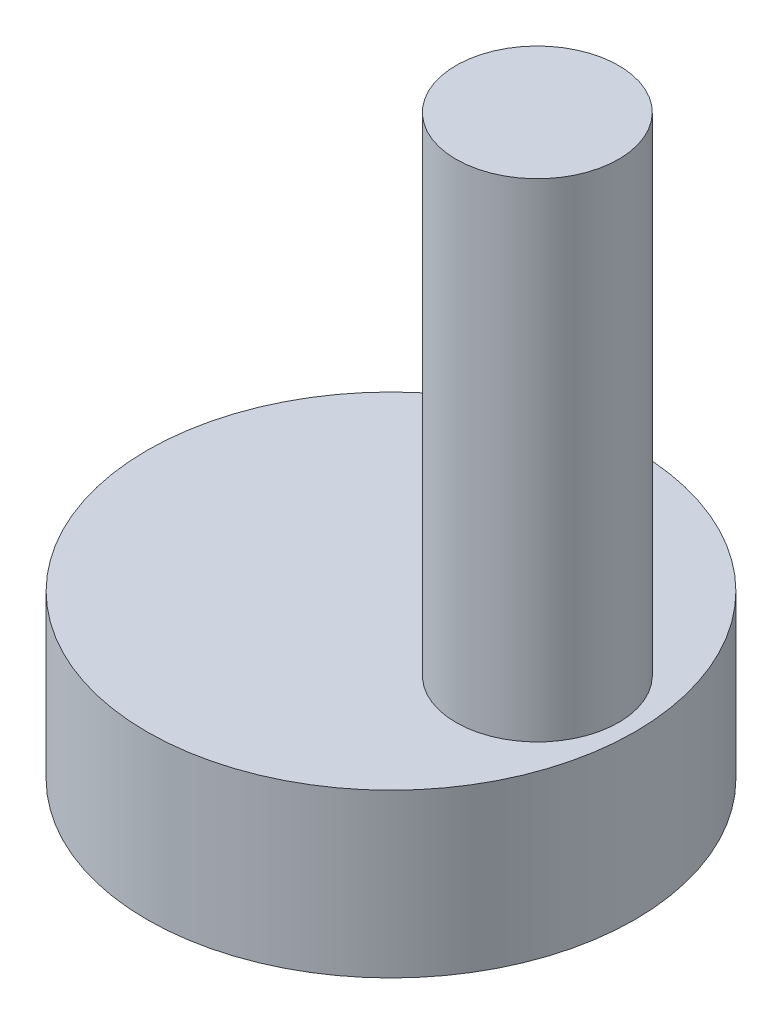
ISO-10303-21;
HEADER;
FILE_DESCRIPTION(('STEP AP214'),'2;1');
FILE_NAME('part.step','',(''),(''),'','','');
FILE_SCHEMA(('AUTOMOTIVE_DESIGN { 1 0 10303 214 1 1 1 1 }'));
ENDSEC;
DATA;
#1=APPLICATION_CONTEXT('core data for automotive mechanical design processes');
#2=APPLICATION_PROTOCOL_DEFINITION('international standard','automotive_design',2000,#1);
#3=PRODUCT_CONTEXT('',#1,'mechanical');
#4=PRODUCT('Part','Part','',(#3));
#5=PRODUCT_RELATED_PRODUCT_CATEGORY('part','',(#4));
#6=PRODUCT_DEFINITION_FORMATION('','',#4);
#7=PRODUCT_DEFINITION_CONTEXT('part definition',#1,'design');
#8=PRODUCT_DEFINITION('design','',#6,#7);
#9=PRODUCT_DEFINITION_SHAPE('','',#8);
#10=(LENGTH_UNIT() NAMED_UNIT(*) SI_UNIT(.MILLI.,.METRE.));
#11=(NAMED_UNIT(*) PLANE_ANGLE_UNIT() SI_UNIT($,.RADIAN.));
#12=(NAMED_UNIT(*) SI_UNIT($,.STERADIAN.) SOLID_ANGLE_UNIT());
#13=UNCERTAINTY_MEASURE_WITH_UNIT(LENGTH_MEASURE(1.E-05),#10,'distance_accuracy_value','');
#14=(GEOMETRIC_REPRESENTATION_CONTEXT(3) GLOBAL_UNCERTAINTY_ASSIGNED_CONTEXT((#13)) GLOBAL_UNIT_ASSIGNED_CONTEXT((#10,
#11,#12)) REPRESENTATION_CONTEXT('',''));
#15=CARTESIAN_POINT('',(0.,0.,0.));
#16=DIRECTION('',(0.,0.,1.));
#17=DIRECTION('',(1.,0.,0.));
#18=AXIS2_PLACEMENT_3D('',#15,#16,#17);
#19=CARTESIAN_POINT('',(0.,10.,0.));
#20=DIRECTION('',(0.,1.,0.));
#21=DIRECTION('',(0.,0.,1.));
#22=AXIS2_PLACEMENT_3D('',#19,#20,#21);
#23=PLANE('',#22);
#24=CARTESIAN_POINT('',(0.,10.,0.));
#25=DIRECTION('',(0.,1.,0.));
#26=DIRECTION('',(0.,0.,1.));
#27=AXIS2_PLACEMENT_3D('',#24,#25,#26);
#28=CIRCLE('',#27,15.);
#29=CARTESIAN_POINT('',(0.,10.,15.));
#30=VERTEX_POINT('',#29);
#31=EDGE_CURVE('E10',#30,#30,#28,.T.);
#32=ORIENTED_EDGE('',*,*,#31,.T.);
#33=EDGE_LOOP('',(#32));
#34=FACE_BOUND('',#33,.T.);
#35=CARTESIAN_POINT('',(9.,10.,0.));
#36=DIRECTION('',(0.,1.,0.));
#37=DIRECTION('',(0.,0.,1.));
#38=AXIS2_PLACEMENT_3D('',#35,#36,#37);
#39=CIRCLE('',#38,5.);
#40=CARTESIAN_POINT('',(9.,10.,5.));
#41=VERTEX_POINT('',#40);
#42=EDGE_CURVE('E45',#41,#41,#39,.T.);
#43=ORIENTED_EDGE('',*,*,#42,.F.);
#44=EDGE_LOOP('',(#43));
#45=FACE_BOUND('',#44,.T.);
#46=ADVANCED_FACE('F32',(#34,#45),#23,.T.);
#47=CARTESIAN_POINT('',(0.,10.,0.));
#48=DIRECTION('',(0.,-1.,0.));
#49=DIRECTION('',(0.,0.,-1.));
#50=AXIS2_PLACEMENT_3D('',#47,#48,#49);
#51=CYLINDRICAL_SURFACE('',#50,15.);
#52=ORIENTED_EDGE('',*,*,#31,.F.);
#53=EDGE_LOOP('',(#52));
#54=FACE_BOUND('',#53,.T.);
#55=CARTESIAN_POINT('',(0.,0.,0.));
#56=DIRECTION('',(0.,1.,0.));
#57=DIRECTION('',(0.,0.,1.));
#58=AXIS2_PLACEMENT_3D('',#55,#56,#57);
#59=CIRCLE('',#58,15.);
#60=CARTESIAN_POINT('',(0.,0.,15.));
#61=VERTEX_POINT('',#60);
#62=EDGE_CURVE('E36',#61,#61,#59,.T.);
#63=ORIENTED_EDGE('',*,*,#62,.T.);
#64=EDGE_LOOP('',(#63));
#65=FACE_BOUND('',#64,.T.);
#66=ADVANCED_FACE('F34',(#54,#65),#51,.T.);
#67=CARTESIAN_POINT('',(0.,0.,0.));
#68=DIRECTION('',(0.,1.,0.));
#69=DIRECTION('',(0.,0.,1.));
#70=AXIS2_PLACEMENT_3D('',#67,#68,#69);
#71=PLANE('',#70);
#72=ORIENTED_EDGE('',*,*,#62,.F.);
#73=EDGE_LOOP('',(#72));
#74=FACE_BOUND('',#73,.T.);
#75=ADVANCED_FACE('F56',(#74),#71,.F.);
#76=CARTESIAN_POINT('',(9.,40.,0.));
#77=DIRECTION('',(0.,-1.,0.));
#78=DIRECTION('',(0.,0.,-1.));
#79=AXIS2_PLACEMENT_3D('',#76,#77,#78);
#80=CYLINDRICAL_SURFACE('',#79,5.);
#81=CARTESIAN_POINT('',(9.,40.,0.));
#82=DIRECTION('',(0.,1.,0.));
#83=DIRECTION('',(0.,0.,1.));
#84=AXIS2_PLACEMENT_3D('',#81,#82,#83);
#85=CIRCLE('',#84,5.);
#86=CARTESIAN_POINT('',(9.,40.,5.));
#87=VERTEX_POINT('',#86);
#88=EDGE_CURVE('E43',#87,#87,#85,.T.);
#89=ORIENTED_EDGE('',*,*,#88,.F.);
#90=EDGE_LOOP('',(#89));
#91=FACE_BOUND('',#90,.T.);
#92=ORIENTED_EDGE('',*,*,#42,.T.);
#93=EDGE_LOOP('',(#92));
#94=FACE_BOUND('',#93,.T.);
#95=ADVANCED_FACE('F53',(#91,#94),#80,.T.);
#96=CARTESIAN_POINT('',(9.,40.,0.));
#97=DIRECTION('',(0.,1.,0.));
#98=DIRECTION('',(0.,0.,1.));
#99=AXIS2_PLACEMENT_3D('',#96,#97,#98);
#100=PLANE('',#99);
#101=ORIENTED_EDGE('',*,*,#88,.T.);
#102=EDGE_LOOP('',(#101));
#103=FACE_BOUND('',#102,.T.);
#104=ADVANCED_FACE('F51',(#103),#100,.T.);
#105=CLOSED_SHELL('',(#46,#66,#75,#95,#104));
#106=MANIFOLD_SOLID_BREP('B2',#105);
#107=ADVANCED_BREP_SHAPE_REPRESENTATION('',(#18,#106),#14);
#108=SHAPE_DEFINITION_REPRESENTATION(#9,#107);
ENDSEC;
END-ISO-10303-21;
